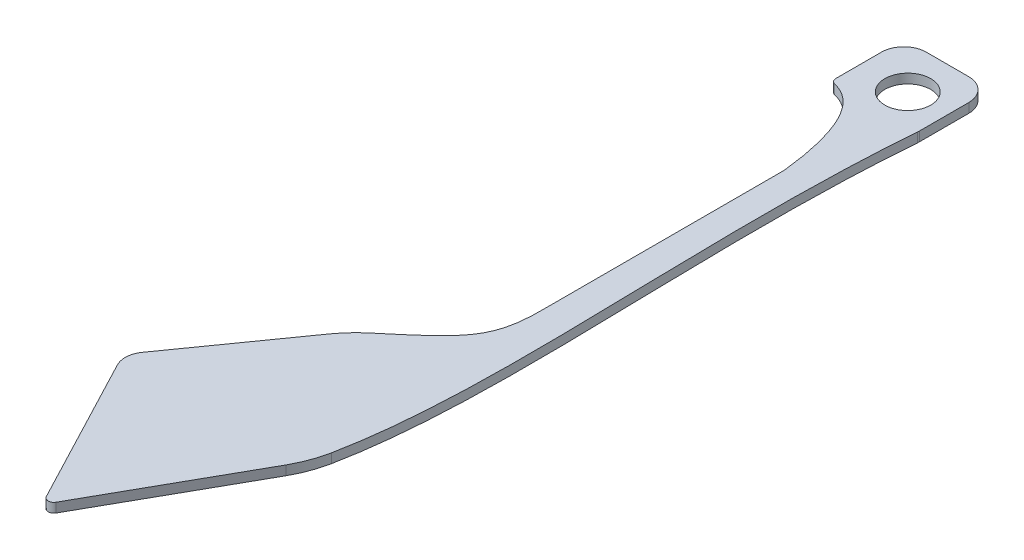
ISO-10303-21;
HEADER;
FILE_DESCRIPTION(('STEP AP214'),'2;1');
FILE_NAME('part.step','',(''),(''),'','','');
FILE_SCHEMA(('AUTOMOTIVE_DESIGN { 1 0 10303 214 1 1 1 1 }'));
ENDSEC;
DATA;
#1=APPLICATION_CONTEXT('core data for automotive mechanical design processes');
#2=APPLICATION_PROTOCOL_DEFINITION('international standard','automotive_design',2000,#1);
#3=PRODUCT_CONTEXT('',#1,'mechanical');
#4=PRODUCT('Part','Part','',(#3));
#5=PRODUCT_RELATED_PRODUCT_CATEGORY('part','',(#4));
#6=PRODUCT_DEFINITION_FORMATION('','',#4);
#7=PRODUCT_DEFINITION_CONTEXT('part definition',#1,'design');
#8=PRODUCT_DEFINITION('design','',#6,#7);
#9=PRODUCT_DEFINITION_SHAPE('','',#8);
#10=(LENGTH_UNIT() NAMED_UNIT(*) SI_UNIT(.MILLI.,.METRE.));
#11=(NAMED_UNIT(*) PLANE_ANGLE_UNIT() SI_UNIT($,.RADIAN.));
#12=(NAMED_UNIT(*) SI_UNIT($,.STERADIAN.) SOLID_ANGLE_UNIT());
#13=UNCERTAINTY_MEASURE_WITH_UNIT(LENGTH_MEASURE(1.E-05),#10,'distance_accuracy_value','');
#14=(GEOMETRIC_REPRESENTATION_CONTEXT(3) GLOBAL_UNCERTAINTY_ASSIGNED_CONTEXT((#13)) GLOBAL_UNIT_ASSIGNED_CONTEXT((#10,
#11,#12)) REPRESENTATION_CONTEXT('',''));
#15=CARTESIAN_POINT('',(0.,0.,0.));
#16=DIRECTION('',(0.,0.,1.));
#17=DIRECTION('',(1.,0.,0.));
#18=AXIS2_PLACEMENT_3D('',#15,#16,#17);
#19=CARTESIAN_POINT('',(2.49999999999999,0.42,-68.));
#20=CARTESIAN_POINT('',(6.3647415815063,0.42,-67.5768511235133));
#21=CARTESIAN_POINT('',(7.29999999999999,0.42,-59.));
#22=B_SPLINE_CURVE_WITH_KNOTS('',2,(#19,#20,#21),.UNSPECIFIED.,.F.,.F.,(3,3),(0.,1.),.UNSPECIFIED.);
#23=DIRECTION('',(0.,-1.,0.));
#24=VECTOR('',#23,1.);
#25=SURFACE_OF_LINEAR_EXTRUSION('',#22,#24);
#26=CARTESIAN_POINT('',(2.49999999999999,-0.42,-68.));
#27=CARTESIAN_POINT('',(6.3647415815063,-0.42,-67.5768511235133));
#28=CARTESIAN_POINT('',(7.29999999999999,-0.42,-59.));
#29=B_SPLINE_CURVE_WITH_KNOTS('',2,(#26,#27,#28),.UNSPECIFIED.,.F.,.F.,(3,3),(0.,1.),.UNSPECIFIED.);
#30=CARTESIAN_POINT('',(2.88944110343177,-0.42,-67.9349845605461));
#31=VERTEX_POINT('',#30);
#32=CARTESIAN_POINT('',(7.28757495151825,-0.42,-59.1124309318197));
#33=VERTEX_POINT('',#32);
#34=EDGE_CURVE('E351',#31,#33,#29,.T.);
#35=ORIENTED_EDGE('',*,*,#34,.T.);
#36=DIRECTION('',(0.,-1.,0.));
#37=VECTOR('',#36,1.);
#38=CARTESIAN_POINT('',(7.28757495151825,-0.42,-59.1124309318197));
#39=LINE('',#38,#37);
#40=CARTESIAN_POINT('',(7.28757495151825,0.42,-59.1124309318197));
#41=VERTEX_POINT('',#40);
#42=EDGE_CURVE('E345',#33,#41,#39,.F.);
#43=ORIENTED_EDGE('',*,*,#42,.T.);
#44=CARTESIAN_POINT('',(2.88944110343177,0.42,-67.9349845605461));
#45=VERTEX_POINT('',#44);
#46=EDGE_CURVE('E228',#45,#41,#22,.T.);
#47=ORIENTED_EDGE('',*,*,#46,.F.);
#48=DIRECTION('',(0.,-1.,0.));
#49=VECTOR('',#48,1.);
#50=CARTESIAN_POINT('',(2.8894411034363,0.42,-67.9349845605451));
#51=LINE('',#50,#49);
#52=EDGE_CURVE('E249',#45,#31,#51,.T.);
#53=ORIENTED_EDGE('',*,*,#52,.T.);
#54=EDGE_LOOP('',(#35,#43,#47,#53));
#55=FACE_BOUND('',#54,.T.);
#56=ADVANCED_FACE('F39',(#55),#25,.F.);
#57=CARTESIAN_POINT('',(7.29999999999999,0.42,-59.));
#58=DIRECTION('',(1.,0.,0.));
#59=DIRECTION('',(0.,0.,-1.));
#60=AXIS2_PLACEMENT_3D('',#57,#58,#59);
#61=PLANE('',#60);
#62=DIRECTION('',(0.,0.,1.));
#63=VECTOR('',#62,1.);
#64=CARTESIAN_POINT('',(7.29999999999999,-0.42,-59.));
#65=LINE('',#64,#63);
#66=CARTESIAN_POINT('',(7.29999999999999,-0.42,-58.8898420459849));
#67=VERTEX_POINT('',#66);
#68=CARTESIAN_POINT('',(7.29999999999999,-0.42,-38.0186347256267));
#69=VERTEX_POINT('',#68);
#70=EDGE_CURVE('E352',#67,#69,#65,.T.);
#71=ORIENTED_EDGE('',*,*,#70,.T.);
#72=DIRECTION('',(0.,-1.,0.));
#73=VECTOR('',#72,1.);
#74=CARTESIAN_POINT('',(7.29999999999999,0.42,-38.0186347256267));
#75=LINE('',#74,#73);
#76=CARTESIAN_POINT('',(7.29999999999999,0.42,-38.0186347256267));
#77=VERTEX_POINT('',#76);
#78=EDGE_CURVE('E63',#69,#77,#75,.F.);
#79=ORIENTED_EDGE('',*,*,#78,.T.);
#80=DIRECTION('',(0.,0.,1.));
#81=VECTOR('',#80,1.);
#82=CARTESIAN_POINT('',(7.29999999999999,0.42,-59.));
#83=LINE('',#82,#81);
#84=CARTESIAN_POINT('',(7.29999999999999,0.42,-58.8898420459849));
#85=VERTEX_POINT('',#84);
#86=EDGE_CURVE('E365',#85,#77,#83,.T.);
#87=ORIENTED_EDGE('',*,*,#86,.F.);
#88=DIRECTION('',(0.,1.,0.));
#89=VECTOR('',#88,1.);
#90=CARTESIAN_POINT('',(7.29999999999999,-0.42,-58.8898420459849));
#91=LINE('',#90,#89);
#92=EDGE_CURVE('E339',#85,#67,#91,.F.);
#93=ORIENTED_EDGE('',*,*,#92,.T.);
#94=EDGE_LOOP('',(#71,#79,#87,#93));
#95=FACE_BOUND('',#94,.T.);
#96=ADVANCED_FACE('F366',(#95),#61,.F.);
#97=CARTESIAN_POINT('',(7.3,0.42,-38.));
#98=CARTESIAN_POINT('',(7.40070922790046,0.42,-32.6745142174048));
#99=CARTESIAN_POINT('',(6.14707667491354,0.42,-31.9100338065075));
#100=CARTESIAN_POINT('',(0.382846680649186,0.42,-27.0812248532739));
#101=B_SPLINE_CURVE_WITH_KNOTS('',3,(#97,#98,#99,#100),.UNSPECIFIED.,.F.,.F.,(4,4),(0.,1.),.UNSPECIFIED.);
#102=DIRECTION('',(0.,-1.,0.));
#103=VECTOR('',#102,1.);
#104=SURFACE_OF_LINEAR_EXTRUSION('',#101,#103);
#105=CARTESIAN_POINT('',(7.30033733419369,0.42,-37.9819029549033));
#106=VERTEX_POINT('',#105);
#107=CARTESIAN_POINT('',(1.38129854213453,0.42,-27.9158322200809));
#108=VERTEX_POINT('',#107);
#109=EDGE_CURVE('E368',#106,#108,#101,.T.);
#110=ORIENTED_EDGE('',*,*,#109,.F.);
#111=DIRECTION('',(0.,-1.,0.));
#112=VECTOR('',#111,1.);
#113=CARTESIAN_POINT('',(7.3003373341937,0.42,-37.9819029549033));
#114=LINE('',#113,#112);
#115=CARTESIAN_POINT('',(7.30033733419369,-0.42,-37.9819029549033));
#116=VERTEX_POINT('',#115);
#117=EDGE_CURVE('E335',#106,#116,#114,.T.);
#118=ORIENTED_EDGE('',*,*,#117,.T.);
#119=CARTESIAN_POINT('',(7.3,-0.42,-38.));
#120=CARTESIAN_POINT('',(7.40070922790046,-0.42,-32.6745142174048));
#121=CARTESIAN_POINT('',(6.14707667491354,-0.42,-31.9100338065075));
#122=CARTESIAN_POINT('',(0.382846680649186,-0.42,-27.0812248532739));
#123=B_SPLINE_CURVE_WITH_KNOTS('',3,(#119,#120,#121,#122),.UNSPECIFIED.,.F.,.F.,(4,4),(0.,1.),.UNSPECIFIED.);
#124=CARTESIAN_POINT('',(1.38129854213453,-0.42,-27.9158322200809));
#125=VERTEX_POINT('',#124);
#126=EDGE_CURVE('E437',#116,#125,#123,.T.);
#127=ORIENTED_EDGE('',*,*,#126,.T.);
#128=DIRECTION('',(0.,-1.,0.));
#129=VECTOR('',#128,1.);
#130=CARTESIAN_POINT('',(1.38129854213463,-0.42,-27.915832220081));
#131=LINE('',#130,#129);
#132=EDGE_CURVE('E245',#125,#108,#131,.F.);
#133=ORIENTED_EDGE('',*,*,#132,.T.);
#134=EDGE_LOOP('',(#110,#118,#127,#133));
#135=FACE_BOUND('',#134,.T.);
#136=ADVANCED_FACE('F388',(#135),#104,.F.);
#137=CARTESIAN_POINT('',(-8.00000000000001,0.42,-15.25));
#138=DIRECTION('',(0.815946541605103,0.,0.578127357286154));
#139=DIRECTION('',(0.578127357286154,0.,-0.815946541605103));
#140=AXIS2_PLACEMENT_3D('',#137,#138,#139);
#141=PLANE('',#140);
#142=DIRECTION('',(-0.578127357286154,0.,0.815946541605103));
#143=VECTOR('',#142,1.);
#144=CARTESIAN_POINT('',(-8.00000000000001,-0.42,-15.25));
#145=LINE('',#144,#143);
#146=CARTESIAN_POINT('',(-0.367431686981779,-0.42,-26.022311048912));
#147=VERTEX_POINT('',#146);
#148=CARTESIAN_POINT('',(-7.29144619961959,-0.42,-16.2500253675513));
#149=VERTEX_POINT('',#148);
#150=EDGE_CURVE('E441',#147,#149,#145,.T.);
#151=ORIENTED_EDGE('',*,*,#150,.T.);
#152=DIRECTION('',(0.,-1.,0.));
#153=VECTOR('',#152,1.);
#154=CARTESIAN_POINT('',(-7.29144619961959,0.42,-16.2500253675513));
#155=LINE('',#154,#153);
#156=CARTESIAN_POINT('',(-7.29144619961959,0.42,-16.2500253675513));
#157=VERTEX_POINT('',#156);
#158=EDGE_CURVE('E299',#149,#157,#155,.F.);
#159=ORIENTED_EDGE('',*,*,#158,.T.);
#160=DIRECTION('',(-0.578127357286154,0.,0.815946541605103));
#161=VECTOR('',#160,1.);
#162=CARTESIAN_POINT('',(-8.00000000000001,0.42,-15.25));
#163=LINE('',#162,#161);
#164=CARTESIAN_POINT('',(-0.367431686981779,0.42,-26.022311048912));
#165=VERTEX_POINT('',#164);
#166=EDGE_CURVE('E372',#165,#157,#163,.T.);
#167=ORIENTED_EDGE('',*,*,#166,.F.);
#168=DIRECTION('',(0.,-1.,0.));
#169=VECTOR('',#168,1.);
#170=CARTESIAN_POINT('',(-0.36743168698178,0.42,-26.022311048912));
#171=LINE('',#170,#169);
#172=EDGE_CURVE('E241',#165,#147,#171,.T.);
#173=ORIENTED_EDGE('',*,*,#172,.T.);
#174=EDGE_LOOP('',(#151,#159,#167,#173));
#175=FACE_BOUND('',#174,.T.);
#176=ADVANCED_FACE('F392',(#175),#141,.F.);
#177=CARTESIAN_POINT('',(-8.00000000000001,0.42,-15.25));
#178=DIRECTION('',(0.8855472253378,0.,-0.464549364111634));
#179=DIRECTION('',(-0.464549364111634,0.,-0.8855472253378));
#180=AXIS2_PLACEMENT_3D('',#177,#178,#179);
#181=PLANE('',#180);
#182=DIRECTION('',(0.464549364111634,0.,0.8855472253378));
#183=VECTOR('',#182,1.);
#184=CARTESIAN_POINT('',(-8.00000000000001,-0.42,-15.25));
#185=LINE('',#184,#183);
#186=CARTESIAN_POINT('',(-7.43064756708499,-0.42,-14.1646719247557));
#187=VERTEX_POINT('',#186);
#188=CARTESIAN_POINT('',(-0.427796746973085,-0.42,-0.815487548917443));
#189=VERTEX_POINT('',#188);
#190=EDGE_CURVE('E214',#187,#189,#185,.T.);
#191=ORIENTED_EDGE('',*,*,#190,.T.);
#192=DIRECTION('',(0.,-1.,0.));
#193=VECTOR('',#192,1.);
#194=CARTESIAN_POINT('',(-0.427796746973084,0.42,-0.815487548917443));
#195=LINE('',#194,#193);
#196=CARTESIAN_POINT('',(-0.427796746973085,0.42,-0.815487548917443));
#197=VERTEX_POINT('',#196);
#198=EDGE_CURVE('E312',#189,#197,#195,.F.);
#199=ORIENTED_EDGE('',*,*,#198,.T.);
#200=DIRECTION('',(0.464549364111634,0.,0.8855472253378));
#201=VECTOR('',#200,1.);
#202=CARTESIAN_POINT('',(-8.00000000000001,0.42,-15.25));
#203=LINE('',#202,#201);
#204=CARTESIAN_POINT('',(-7.43064756708499,0.42,-14.1646719247557));
#205=VERTEX_POINT('',#204);
#206=EDGE_CURVE('E466',#205,#197,#203,.T.);
#207=ORIENTED_EDGE('',*,*,#206,.F.);
#208=DIRECTION('',(0.,-1.,0.));
#209=VECTOR('',#208,1.);
#210=CARTESIAN_POINT('',(-7.43064756708499,0.42,-14.1646719247557));
#211=LINE('',#210,#209);
#212=EDGE_CURVE('E292',#205,#187,#211,.T.);
#213=ORIENTED_EDGE('',*,*,#212,.T.);
#214=EDGE_LOOP('',(#191,#199,#207,#213));
#215=FACE_BOUND('',#214,.T.);
#216=ADVANCED_FACE('F458',(#215),#181,.F.);
#217=CARTESIAN_POINT('',(0.,0.42,0.));
#218=DIRECTION('',(-0.871907465306406,0.,-0.489670677029938));
#219=DIRECTION('',(-0.489670677029938,0.,0.871907465306406));
#220=AXIS2_PLACEMENT_3D('',#217,#218,#219);
#221=PLANE('',#220);
#222=DIRECTION('',(0.489670677029938,0.,-0.871907465306406));
#223=VECTOR('',#222,1.);
#224=CARTESIAN_POINT('',(0.,0.42,0.));
#225=LINE('',#224,#223);
#226=CARTESIAN_POINT('',(0.45093059834902,0.42,-0.80292689245829));
#227=VERTEX_POINT('',#226);
#228=CARTESIAN_POINT('',(7.84433889687078,0.42,-13.967627561568));
#229=VERTEX_POINT('',#228);
#230=EDGE_CURVE('E465',#227,#229,#225,.T.);
#231=ORIENTED_EDGE('',*,*,#230,.F.);
#232=DIRECTION('',(0.,-1.,0.));
#233=VECTOR('',#232,1.);
#234=CARTESIAN_POINT('',(0.45093059834902,0.42,-0.80292689245829));
#235=LINE('',#234,#233);
#236=CARTESIAN_POINT('',(0.45093059834902,-0.42,-0.80292689245829));
#237=VERTEX_POINT('',#236);
#238=EDGE_CURVE('E305',#227,#237,#235,.T.);
#239=ORIENTED_EDGE('',*,*,#238,.T.);
#240=DIRECTION('',(0.489670677029938,0.,-0.871907465306406));
#241=VECTOR('',#240,1.);
#242=CARTESIAN_POINT('',(0.,-0.42,0.));
#243=LINE('',#242,#241);
#244=CARTESIAN_POINT('',(7.84433889687078,-0.42,-13.967627561568));
#245=VERTEX_POINT('',#244);
#246=EDGE_CURVE('E208',#237,#245,#243,.T.);
#247=ORIENTED_EDGE('',*,*,#246,.T.);
#248=DIRECTION('',(0.,-1.,0.));
#249=VECTOR('',#248,1.);
#250=CARTESIAN_POINT('',(7.84433889687078,0.42,-13.967627561568));
#251=LINE('',#250,#249);
#252=EDGE_CURVE('E185',#245,#229,#251,.F.);
#253=ORIENTED_EDGE('',*,*,#252,.T.);
#254=EDGE_LOOP('',(#231,#239,#247,#253));
#255=FACE_BOUND('',#254,.T.);
#256=ADVANCED_FACE('F468',(#255),#221,.F.);
#257=CARTESIAN_POINT('',(8.56453020743702,0.42,-15.25));
#258=CARTESIAN_POINT('',(11.8168917487992,0.42,-28.4825570390397));
#259=CARTESIAN_POINT('',(8.71439861678246,0.42,-49.1108253899896));
#260=CARTESIAN_POINT('',(10.3,0.42,-68.));
#261=B_SPLINE_CURVE_WITH_KNOTS('',3,(#257,#258,#259,#260),.UNSPECIFIED.,.F.,.F.,(4,4),(0.,1.),.UNSPECIFIED.);
#262=DIRECTION('',(0.,-1.,0.));
#263=VECTOR('',#262,1.);
#264=SURFACE_OF_LINEAR_EXTRUSION('',#261,#263);
#265=CARTESIAN_POINT('',(8.56453020743702,-0.42,-15.25));
#266=CARTESIAN_POINT('',(11.8168917487992,-0.42,-28.4825570390397));
#267=CARTESIAN_POINT('',(8.71439861678246,-0.42,-49.1108253899896));
#268=CARTESIAN_POINT('',(10.3,-0.42,-68.));
#269=B_SPLINE_CURVE_WITH_KNOTS('',3,(#265,#266,#267,#268),.UNSPECIFIED.,.F.,.F.,(4,4),(0.,1.),.UNSPECIFIED.);
#270=CARTESIAN_POINT('',(8.9330406365142,-0.42,-16.9130470053443));
#271=VERTEX_POINT('',#270);
#272=CARTESIAN_POINT('',(10.2931135464354,-0.42,-67.9175973041701));
#273=VERTEX_POINT('',#272);
#274=EDGE_CURVE('E196',#271,#273,#269,.T.);
#275=ORIENTED_EDGE('',*,*,#274,.T.);
#276=DIRECTION('',(0.,-1.,0.));
#277=VECTOR('',#276,1.);
#278=CARTESIAN_POINT('',(10.2931135464356,-0.42,-67.9175973041725));
#279=LINE('',#278,#277);
#280=CARTESIAN_POINT('',(10.2931135464354,0.42,-67.9175973041701));
#281=VERTEX_POINT('',#280);
#282=EDGE_CURVE('E327',#273,#281,#279,.F.);
#283=ORIENTED_EDGE('',*,*,#282,.T.);
#284=CARTESIAN_POINT('',(8.9330406365142,0.42,-16.9130470053443));
#285=VERTEX_POINT('',#284);
#286=EDGE_CURVE('E199',#285,#281,#261,.T.);
#287=ORIENTED_EDGE('',*,*,#286,.F.);
#288=DIRECTION('',(0.,-1.,0.));
#289=VECTOR('',#288,1.);
#290=CARTESIAN_POINT('',(8.9330406365142,0.42,-16.9130470053443));
#291=LINE('',#290,#289);
#292=EDGE_CURVE('E183',#285,#271,#291,.T.);
#293=ORIENTED_EDGE('',*,*,#292,.T.);
#294=EDGE_LOOP('',(#275,#283,#287,#293));
#295=FACE_BOUND('',#294,.T.);
#296=ADVANCED_FACE('F195',(#295),#264,.F.);
#297=CARTESIAN_POINT('',(10.3,0.42,-74.5));
#298=DIRECTION('',(-1.,0.,0.));
#299=DIRECTION('',(0.,0.,1.));
#300=AXIS2_PLACEMENT_3D('',#297,#298,#299);
#301=PLANE('',#300);
#302=DIRECTION('',(0.,0.,-1.));
#303=VECTOR('',#302,1.);
#304=CARTESIAN_POINT('',(10.3,0.42,-74.5));
#305=LINE('',#304,#303);
#306=CARTESIAN_POINT('',(10.3,0.42,-68.0834236923464));
#307=VERTEX_POINT('',#306);
#308=CARTESIAN_POINT('',(10.3,0.42,-72.5));
#309=VERTEX_POINT('',#308);
#310=EDGE_CURVE('E473',#307,#309,#305,.T.);
#311=ORIENTED_EDGE('',*,*,#310,.F.);
#312=DIRECTION('',(0.,-1.,0.));
#313=VECTOR('',#312,1.);
#314=CARTESIAN_POINT('',(10.3,0.42,-68.0834236923464));
#315=LINE('',#314,#313);
#316=CARTESIAN_POINT('',(10.3,-0.42,-68.0834236923464));
#317=VERTEX_POINT('',#316);
#318=EDGE_CURVE('E318',#307,#317,#315,.T.);
#319=ORIENTED_EDGE('',*,*,#318,.T.);
#320=DIRECTION('',(0.,0.,-1.));
#321=VECTOR('',#320,1.);
#322=CARTESIAN_POINT('',(10.3,-0.42,-74.5));
#323=LINE('',#322,#321);
#324=CARTESIAN_POINT('',(10.3,-0.42,-72.5));
#325=VERTEX_POINT('',#324);
#326=EDGE_CURVE('E207',#317,#325,#323,.T.);
#327=ORIENTED_EDGE('',*,*,#326,.T.);
#328=DIRECTION('',(0.,-1.,0.));
#329=VECTOR('',#328,1.);
#330=CARTESIAN_POINT('',(10.3,0.42,-72.5));
#331=LINE('',#330,#329);
#332=EDGE_CURVE('E288',#325,#309,#331,.F.);
#333=ORIENTED_EDGE('',*,*,#332,.T.);
#334=EDGE_LOOP('',(#311,#319,#327,#333));
#335=FACE_BOUND('',#334,.T.);
#336=ADVANCED_FACE('F487',(#335),#301,.F.);
#337=CARTESIAN_POINT('',(2.49999999999999,0.42,-74.5));
#338=DIRECTION('',(0.,0.,1.));
#339=DIRECTION('',(1.,0.,0.));
#340=AXIS2_PLACEMENT_3D('',#337,#338,#339);
#341=PLANE('',#340);
#342=DIRECTION('',(-1.,0.,0.));
#343=VECTOR('',#342,1.);
#344=CARTESIAN_POINT('',(2.49999999999999,-0.42,-74.5));
#345=LINE('',#344,#343);
#346=CARTESIAN_POINT('',(8.29999999999998,-0.42,-74.5));
#347=VERTEX_POINT('',#346);
#348=CARTESIAN_POINT('',(4.49999999999999,-0.42,-74.5));
#349=VERTEX_POINT('',#348);
#350=EDGE_CURVE('E212',#347,#349,#345,.T.);
#351=ORIENTED_EDGE('',*,*,#350,.T.);
#352=DIRECTION('',(0.,-1.,0.));
#353=VECTOR('',#352,1.);
#354=CARTESIAN_POINT('',(4.49999999999999,0.42,-74.5));
#355=LINE('',#354,#353);
#356=CARTESIAN_POINT('',(4.49999999999999,0.42,-74.5));
#357=VERTEX_POINT('',#356);
#358=EDGE_CURVE('E279',#349,#357,#355,.F.);
#359=ORIENTED_EDGE('',*,*,#358,.T.);
#360=DIRECTION('',(-1.,0.,0.));
#361=VECTOR('',#360,1.);
#362=CARTESIAN_POINT('',(2.49999999999999,0.42,-74.5));
#363=LINE('',#362,#361);
#364=CARTESIAN_POINT('',(8.29999999999998,0.42,-74.5));
#365=VERTEX_POINT('',#364);
#366=EDGE_CURVE('E639',#365,#357,#363,.T.);
#367=ORIENTED_EDGE('',*,*,#366,.F.);
#368=DIRECTION('',(0.,-1.,0.));
#369=VECTOR('',#368,1.);
#370=CARTESIAN_POINT('',(8.29999999999998,0.42,-74.5));
#371=LINE('',#370,#369);
#372=EDGE_CURVE('E275',#365,#347,#371,.T.);
#373=ORIENTED_EDGE('',*,*,#372,.T.);
#374=EDGE_LOOP('',(#351,#359,#367,#373));
#375=FACE_BOUND('',#374,.T.);
#376=ADVANCED_FACE('F594',(#375),#341,.F.);
#377=CARTESIAN_POINT('',(2.49999999999999,0.42,-68.));
#378=DIRECTION('',(1.,0.,0.));
#379=DIRECTION('',(0.,0.,-1.));
#380=AXIS2_PLACEMENT_3D('',#377,#378,#379);
#381=PLANE('',#380);
#382=DIRECTION('',(0.,0.,1.));
#383=VECTOR('',#382,1.);
#384=CARTESIAN_POINT('',(2.49999999999999,0.42,-68.));
#385=LINE('',#384,#383);
#386=CARTESIAN_POINT('',(2.49999999999999,0.42,-72.5));
#387=VERTEX_POINT('',#386);
#388=CARTESIAN_POINT('',(2.49999999999999,0.42,-68.4226081145195));
#389=VERTEX_POINT('',#388);
#390=EDGE_CURVE('E201',#387,#389,#385,.T.);
#391=ORIENTED_EDGE('',*,*,#390,.F.);
#392=DIRECTION('',(0.,-1.,0.));
#393=VECTOR('',#392,1.);
#394=CARTESIAN_POINT('',(2.49999999999999,0.42,-72.5));
#395=LINE('',#394,#393);
#396=CARTESIAN_POINT('',(2.49999999999999,-0.42,-72.5));
#397=VERTEX_POINT('',#396);
#398=EDGE_CURVE('E264',#387,#397,#395,.T.);
#399=ORIENTED_EDGE('',*,*,#398,.T.);
#400=DIRECTION('',(0.,0.,1.));
#401=VECTOR('',#400,1.);
#402=CARTESIAN_POINT('',(2.49999999999999,-0.42,-68.));
#403=LINE('',#402,#401);
#404=CARTESIAN_POINT('',(2.49999999999999,-0.42,-68.4226081145195));
#405=VERTEX_POINT('',#404);
#406=EDGE_CURVE('E226',#397,#405,#403,.T.);
#407=ORIENTED_EDGE('',*,*,#406,.T.);
#408=DIRECTION('',(0.,-1.,0.));
#409=VECTOR('',#408,1.);
#410=CARTESIAN_POINT('',(2.49999999999999,0.42,-68.4226081145195));
#411=LINE('',#410,#409);
#412=EDGE_CURVE('E257',#405,#389,#411,.F.);
#413=ORIENTED_EDGE('',*,*,#412,.T.);
#414=EDGE_LOOP('',(#391,#399,#407,#413));
#415=FACE_BOUND('',#414,.T.);
#416=ADVANCED_FACE('F586',(#415),#381,.F.);
#417=CARTESIAN_POINT('',(5.63237079075314,0.42,-65.5384255617566));
#418=DIRECTION('',(0.,1.,0.));
#419=DIRECTION('',(0.,0.,1.));
#420=AXIS2_PLACEMENT_3D('',#417,#418,#419);
#421=PLANE('',#420);
#422=CARTESIAN_POINT('',(6.74999999999998,0.42,-70.6));
#423=DIRECTION('',(0.,1.,0.));
#424=DIRECTION('',(0.,0.,1.));
#425=AXIS2_PLACEMENT_3D('',#422,#423,#424);
#426=CIRCLE('',#425,2.05);
#427=CARTESIAN_POINT('',(6.74999999999998,0.42,-68.55));
#428=VERTEX_POINT('',#427);
#429=EDGE_CURVE('E662',#428,#428,#426,.T.);
#430=ORIENTED_EDGE('',*,*,#429,.F.);
#431=EDGE_LOOP('',(#430));
#432=FACE_BOUND('',#431,.T.);
#433=ORIENTED_EDGE('',*,*,#286,.T.);
#434=CARTESIAN_POINT('',(8.29999999999999,0.42,-68.0834236923464));
#435=DIRECTION('',(0.,1.,0.));
#436=DIRECTION('',(0.,0.,1.));
#437=AXIS2_PLACEMENT_3D('',#434,#435,#436);
#438=CIRCLE('',#437,2.);
#439=EDGE_CURVE('E332',#281,#307,#438,.T.);
#440=ORIENTED_EDGE('',*,*,#439,.T.);
#441=ORIENTED_EDGE('',*,*,#310,.T.);
#442=CARTESIAN_POINT('',(8.29999999999998,0.42,-72.5));
#443=DIRECTION('',(0.,1.,0.));
#444=DIRECTION('',(0.,0.,1.));
#445=AXIS2_PLACEMENT_3D('',#442,#443,#444);
#446=CIRCLE('',#445,2.);
#447=EDGE_CURVE('E282',#309,#365,#446,.T.);
#448=ORIENTED_EDGE('',*,*,#447,.T.);
#449=ORIENTED_EDGE('',*,*,#366,.T.);
#450=CARTESIAN_POINT('',(4.49999999999999,0.42,-72.5));
#451=DIRECTION('',(0.,1.,0.));
#452=DIRECTION('',(0.,0.,1.));
#453=AXIS2_PLACEMENT_3D('',#450,#451,#452);
#454=CIRCLE('',#453,2.);
#455=EDGE_CURVE('E285',#357,#387,#454,.T.);
#456=ORIENTED_EDGE('',*,*,#455,.T.);
#457=ORIENTED_EDGE('',*,*,#390,.T.);
#458=CARTESIAN_POINT('',(2.99999999999999,0.42,-68.4226081145195));
#459=DIRECTION('',(0.,1.,0.));
#460=DIRECTION('',(0.,0.,1.));
#461=AXIS2_PLACEMENT_3D('',#458,#459,#460);
#462=CIRCLE('',#461,0.5);
#463=EDGE_CURVE('E261',#389,#45,#462,.T.);
#464=ORIENTED_EDGE('',*,*,#463,.T.);
#465=ORIENTED_EDGE('',*,*,#46,.T.);
#466=CARTESIAN_POINT('',(5.29999999999998,0.42,-58.8898420459849));
#467=DIRECTION('',(0.,1.,0.));
#468=DIRECTION('',(0.,0.,1.));
#469=AXIS2_PLACEMENT_3D('',#466,#467,#468);
#470=CIRCLE('',#469,2.);
#471=EDGE_CURVE('E11',#41,#85,#470,.F.);
#472=ORIENTED_EDGE('',*,*,#471,.T.);
#473=ORIENTED_EDGE('',*,*,#86,.T.);
#474=CARTESIAN_POINT('',(9.29999999999999,0.42,-38.0186347256267));
#475=DIRECTION('',(0.,1.,0.));
#476=DIRECTION('',(0.,0.,1.));
#477=AXIS2_PLACEMENT_3D('',#474,#475,#476);
#478=CIRCLE('',#477,2.);
#479=EDGE_CURVE('E55',#77,#106,#478,.T.);
#480=ORIENTED_EDGE('',*,*,#479,.T.);
#481=ORIENTED_EDGE('',*,*,#109,.T.);
#482=CARTESIAN_POINT('',(7.79203372906925,0.42,-20.2410374760504));
#483=DIRECTION('',(0.,1.,0.));
#484=DIRECTION('',(0.,0.,1.));
#485=AXIS2_PLACEMENT_3D('',#482,#483,#484);
#486=CIRCLE('',#485,10.);
#487=EDGE_CURVE('E235',#108,#165,#486,.T.);
#488=ORIENTED_EDGE('',*,*,#487,.T.);
#489=ORIENTED_EDGE('',*,*,#166,.T.);
#490=CARTESIAN_POINT('',(-5.65955311640939,0.42,-15.093770652979));
#491=DIRECTION('',(0.,1.,0.));
#492=DIRECTION('',(0.,0.,1.));
#493=AXIS2_PLACEMENT_3D('',#490,#491,#492);
#494=CIRCLE('',#493,2.);
#495=EDGE_CURVE('E302',#157,#205,#494,.T.);
#496=ORIENTED_EDGE('',*,*,#495,.T.);
#497=ORIENTED_EDGE('',*,*,#206,.T.);
#498=CARTESIAN_POINT('',(0.0149768656958171,0.42,-1.04776223097326));
#499=DIRECTION('',(0.,1.,0.));
#500=DIRECTION('',(0.,0.,1.));
#501=AXIS2_PLACEMENT_3D('',#498,#499,#500);
#502=CIRCLE('',#501,0.5);
#503=EDGE_CURVE('E315',#197,#227,#502,.T.);
#504=ORIENTED_EDGE('',*,*,#503,.T.);
#505=ORIENTED_EDGE('',*,*,#230,.T.);
#506=CARTESIAN_POINT('',(-0.874735756193287,0.42,-18.8643343318674));
#507=DIRECTION('',(0.,1.,0.));
#508=DIRECTION('',(0.,0.,1.));
#509=AXIS2_PLACEMENT_3D('',#506,#507,#508);
#510=CIRCLE('',#509,10.);
#511=EDGE_CURVE('E238',#229,#285,#510,.T.);
#512=ORIENTED_EDGE('',*,*,#511,.T.);
#513=EDGE_LOOP('',(#433,#440,#441,#448,#449,#456,#457,#464,#465,#472,#473,#480,#481,#488,#489,
#496,#497,#504,#505,#512));
#514=FACE_BOUND('',#513,.T.);
#515=ADVANCED_FACE('F364',(#432,#514),#421,.T.);
#516=CARTESIAN_POINT('',(5.63237079075314,-0.42,-65.5384255617566));
#517=DIRECTION('',(0.,1.,0.));
#518=DIRECTION('',(0.,0.,1.));
#519=AXIS2_PLACEMENT_3D('',#516,#517,#518);
#520=PLANE('',#519);
#521=CARTESIAN_POINT('',(6.74999999999998,-0.42,-70.6));
#522=DIRECTION('',(0.,1.,0.));
#523=DIRECTION('',(0.,0.,1.));
#524=AXIS2_PLACEMENT_3D('',#521,#522,#523);
#525=CIRCLE('',#524,2.05);
#526=CARTESIAN_POINT('',(6.74999999999998,-0.42,-68.55));
#527=VERTEX_POINT('',#526);
#528=EDGE_CURVE('E361',#527,#527,#525,.T.);
#529=ORIENTED_EDGE('',*,*,#528,.T.);
#530=EDGE_LOOP('',(#529));
#531=FACE_BOUND('',#530,.T.);
#532=ORIENTED_EDGE('',*,*,#326,.F.);
#533=CARTESIAN_POINT('',(8.29999999999999,-0.42,-68.0834236923464));
#534=DIRECTION('',(0.,1.,0.));
#535=DIRECTION('',(0.,0.,1.));
#536=AXIS2_PLACEMENT_3D('',#533,#534,#535);
#537=CIRCLE('',#536,2.);
#538=EDGE_CURVE('E205',#317,#273,#537,.F.);
#539=ORIENTED_EDGE('',*,*,#538,.T.);
#540=ORIENTED_EDGE('',*,*,#274,.F.);
#541=CARTESIAN_POINT('',(-0.874735756193287,-0.42,-18.8643343318674));
#542=DIRECTION('',(0.,1.,0.));
#543=DIRECTION('',(0.,0.,1.));
#544=AXIS2_PLACEMENT_3D('',#541,#542,#543);
#545=CIRCLE('',#544,10.);
#546=EDGE_CURVE('E179',#271,#245,#545,.F.);
#547=ORIENTED_EDGE('',*,*,#546,.T.);
#548=ORIENTED_EDGE('',*,*,#246,.F.);
#549=CARTESIAN_POINT('',(0.0149768656958171,-0.42,-1.04776223097326));
#550=DIRECTION('',(0.,1.,0.));
#551=DIRECTION('',(0.,0.,1.));
#552=AXIS2_PLACEMENT_3D('',#549,#550,#551);
#553=CIRCLE('',#552,0.5);
#554=EDGE_CURVE('E309',#237,#189,#553,.F.);
#555=ORIENTED_EDGE('',*,*,#554,.T.);
#556=ORIENTED_EDGE('',*,*,#190,.F.);
#557=CARTESIAN_POINT('',(-5.65955311640939,-0.42,-15.093770652979));
#558=DIRECTION('',(0.,1.,0.));
#559=DIRECTION('',(0.,0.,1.));
#560=AXIS2_PLACEMENT_3D('',#557,#558,#559);
#561=CIRCLE('',#560,2.);
#562=EDGE_CURVE('E296',#187,#149,#561,.F.);
#563=ORIENTED_EDGE('',*,*,#562,.T.);
#564=ORIENTED_EDGE('',*,*,#150,.F.);
#565=CARTESIAN_POINT('',(7.79203372906925,-0.42,-20.2410374760504));
#566=DIRECTION('',(0.,1.,0.));
#567=DIRECTION('',(0.,0.,1.));
#568=AXIS2_PLACEMENT_3D('',#565,#566,#567);
#569=CIRCLE('',#568,10.);
#570=EDGE_CURVE('E190',#147,#125,#569,.F.);
#571=ORIENTED_EDGE('',*,*,#570,.T.);
#572=ORIENTED_EDGE('',*,*,#126,.F.);
#573=CARTESIAN_POINT('',(9.29999999999999,-0.42,-38.0186347256267));
#574=DIRECTION('',(0.,1.,0.));
#575=DIRECTION('',(0.,0.,1.));
#576=AXIS2_PLACEMENT_3D('',#573,#574,#575);
#577=CIRCLE('',#576,2.);
#578=EDGE_CURVE('E322',#116,#69,#577,.F.);
#579=ORIENTED_EDGE('',*,*,#578,.T.);
#580=ORIENTED_EDGE('',*,*,#70,.F.);
#581=CARTESIAN_POINT('',(5.29999999999998,-0.42,-58.8898420459849));
#582=DIRECTION('',(0.,1.,0.));
#583=DIRECTION('',(0.,0.,1.));
#584=AXIS2_PLACEMENT_3D('',#581,#582,#583);
#585=CIRCLE('',#584,2.);
#586=EDGE_CURVE('E48',#67,#33,#585,.T.);
#587=ORIENTED_EDGE('',*,*,#586,.T.);
#588=ORIENTED_EDGE('',*,*,#34,.F.);
#589=CARTESIAN_POINT('',(2.99999999999999,-0.42,-68.4226081145195));
#590=DIRECTION('',(0.,1.,0.));
#591=DIRECTION('',(0.,0.,1.));
#592=AXIS2_PLACEMENT_3D('',#589,#590,#591);
#593=CIRCLE('',#592,0.5);
#594=EDGE_CURVE('E253',#31,#405,#593,.F.);
#595=ORIENTED_EDGE('',*,*,#594,.T.);
#596=ORIENTED_EDGE('',*,*,#406,.F.);
#597=CARTESIAN_POINT('',(4.49999999999999,-0.42,-72.5));
#598=DIRECTION('',(0.,1.,0.));
#599=DIRECTION('',(0.,0.,1.));
#600=AXIS2_PLACEMENT_3D('',#597,#598,#599);
#601=CIRCLE('',#600,2.);
#602=EDGE_CURVE('E272',#397,#349,#601,.F.);
#603=ORIENTED_EDGE('',*,*,#602,.T.);
#604=ORIENTED_EDGE('',*,*,#350,.F.);
#605=CARTESIAN_POINT('',(8.29999999999998,-0.42,-72.5));
#606=DIRECTION('',(0.,1.,0.));
#607=DIRECTION('',(0.,0.,1.));
#608=AXIS2_PLACEMENT_3D('',#605,#606,#607);
#609=CIRCLE('',#608,2.);
#610=EDGE_CURVE('E268',#347,#325,#609,.F.);
#611=ORIENTED_EDGE('',*,*,#610,.T.);
#612=EDGE_LOOP('',(#532,#539,#540,#547,#548,#555,#556,#563,#564,#571,#572,#579,#580,#587,#588,
#595,#596,#603,#604,#611));
#613=FACE_BOUND('',#612,.T.);
#614=ADVANCED_FACE('F204',(#531,#613),#520,.F.);
#615=CARTESIAN_POINT('',(6.74999999999998,-0.42,-70.6));
#616=DIRECTION('',(0.,1.,0.));
#617=DIRECTION('',(0.,0.,1.));
#618=AXIS2_PLACEMENT_3D('',#615,#616,#617);
#619=CYLINDRICAL_SURFACE('',#618,2.05);
#620=ORIENTED_EDGE('',*,*,#528,.F.);
#621=EDGE_LOOP('',(#620));
#622=FACE_BOUND('',#621,.T.);
#623=ORIENTED_EDGE('',*,*,#429,.T.);
#624=EDGE_LOOP('',(#623));
#625=FACE_BOUND('',#624,.T.);
#626=ADVANCED_FACE('F402',(#622,#625),#619,.F.);
#627=CARTESIAN_POINT('',(-0.874735756193287,0.,-18.8643343318674));
#628=DIRECTION('',(0.,-1.,0.));
#629=DIRECTION('',(0.,0.,-1.));
#630=AXIS2_PLACEMENT_3D('',#627,#628,#629);
#631=CYLINDRICAL_SURFACE('',#630,10.);
#632=ORIENTED_EDGE('',*,*,#511,.F.);
#633=ORIENTED_EDGE('',*,*,#252,.F.);
#634=ORIENTED_EDGE('',*,*,#546,.F.);
#635=ORIENTED_EDGE('',*,*,#292,.F.);
#636=EDGE_LOOP('',(#632,#633,#634,#635));
#637=FACE_BOUND('',#636,.T.);
#638=ADVANCED_FACE('F182',(#637),#631,.T.);
#639=CARTESIAN_POINT('',(7.79203372906925,0.,-20.2410374760504));
#640=DIRECTION('',(0.,-1.,0.));
#641=DIRECTION('',(0.,0.,-1.));
#642=AXIS2_PLACEMENT_3D('',#639,#640,#641);
#643=CYLINDRICAL_SURFACE('',#642,10.);
#644=ORIENTED_EDGE('',*,*,#487,.F.);
#645=ORIENTED_EDGE('',*,*,#132,.F.);
#646=ORIENTED_EDGE('',*,*,#570,.F.);
#647=ORIENTED_EDGE('',*,*,#172,.F.);
#648=EDGE_LOOP('',(#644,#645,#646,#647));
#649=FACE_BOUND('',#648,.T.);
#650=ADVANCED_FACE('F401',(#649),#643,.T.);
#651=CARTESIAN_POINT('',(2.99999999999999,0.,-68.4226081145195));
#652=DIRECTION('',(0.,-1.,0.));
#653=DIRECTION('',(0.,0.,-1.));
#654=AXIS2_PLACEMENT_3D('',#651,#652,#653);
#655=CYLINDRICAL_SURFACE('',#654,0.5);
#656=ORIENTED_EDGE('',*,*,#463,.F.);
#657=ORIENTED_EDGE('',*,*,#412,.F.);
#658=ORIENTED_EDGE('',*,*,#594,.F.);
#659=ORIENTED_EDGE('',*,*,#52,.F.);
#660=EDGE_LOOP('',(#656,#657,#658,#659));
#661=FACE_BOUND('',#660,.T.);
#662=ADVANCED_FACE('F405',(#661),#655,.T.);
#663=CARTESIAN_POINT('',(4.49999999999999,0.42,-72.5));
#664=DIRECTION('',(0.,-1.,0.));
#665=DIRECTION('',(0.,0.,-1.));
#666=AXIS2_PLACEMENT_3D('',#663,#664,#665);
#667=CYLINDRICAL_SURFACE('',#666,2.);
#668=ORIENTED_EDGE('',*,*,#455,.F.);
#669=ORIENTED_EDGE('',*,*,#358,.F.);
#670=ORIENTED_EDGE('',*,*,#602,.F.);
#671=ORIENTED_EDGE('',*,*,#398,.F.);
#672=EDGE_LOOP('',(#668,#669,#670,#671));
#673=FACE_BOUND('',#672,.T.);
#674=ADVANCED_FACE('F409',(#673),#667,.T.);
#675=CARTESIAN_POINT('',(8.29999999999998,0.42,-72.5));
#676=DIRECTION('',(0.,-1.,0.));
#677=DIRECTION('',(0.,0.,-1.));
#678=AXIS2_PLACEMENT_3D('',#675,#676,#677);
#679=CYLINDRICAL_SURFACE('',#678,2.);
#680=ORIENTED_EDGE('',*,*,#447,.F.);
#681=ORIENTED_EDGE('',*,*,#332,.F.);
#682=ORIENTED_EDGE('',*,*,#610,.F.);
#683=ORIENTED_EDGE('',*,*,#372,.F.);
#684=EDGE_LOOP('',(#680,#681,#682,#683));
#685=FACE_BOUND('',#684,.T.);
#686=ADVANCED_FACE('F413',(#685),#679,.T.);
#687=CARTESIAN_POINT('',(-5.65955311640939,0.42,-15.093770652979));
#688=DIRECTION('',(0.,-1.,0.));
#689=DIRECTION('',(0.,0.,-1.));
#690=AXIS2_PLACEMENT_3D('',#687,#688,#689);
#691=CYLINDRICAL_SURFACE('',#690,2.);
#692=ORIENTED_EDGE('',*,*,#495,.F.);
#693=ORIENTED_EDGE('',*,*,#158,.F.);
#694=ORIENTED_EDGE('',*,*,#562,.F.);
#695=ORIENTED_EDGE('',*,*,#212,.F.);
#696=EDGE_LOOP('',(#692,#693,#694,#695));
#697=FACE_BOUND('',#696,.T.);
#698=ADVANCED_FACE('F417',(#697),#691,.T.);
#699=CARTESIAN_POINT('',(0.0149768656958171,0.42,-1.04776223097326));
#700=DIRECTION('',(0.,-1.,0.));
#701=DIRECTION('',(0.,0.,-1.));
#702=AXIS2_PLACEMENT_3D('',#699,#700,#701);
#703=CYLINDRICAL_SURFACE('',#702,0.5);
#704=ORIENTED_EDGE('',*,*,#503,.F.);
#705=ORIENTED_EDGE('',*,*,#198,.F.);
#706=ORIENTED_EDGE('',*,*,#554,.F.);
#707=ORIENTED_EDGE('',*,*,#238,.F.);
#708=EDGE_LOOP('',(#704,#705,#706,#707));
#709=FACE_BOUND('',#708,.T.);
#710=ADVANCED_FACE('F421',(#709),#703,.T.);
#711=CARTESIAN_POINT('',(8.29999999999999,0.,-68.0834236923464));
#712=DIRECTION('',(0.,-1.,0.));
#713=DIRECTION('',(0.,0.,-1.));
#714=AXIS2_PLACEMENT_3D('',#711,#712,#713);
#715=CYLINDRICAL_SURFACE('',#714,2.);
#716=ORIENTED_EDGE('',*,*,#439,.F.);
#717=ORIENTED_EDGE('',*,*,#282,.F.);
#718=ORIENTED_EDGE('',*,*,#538,.F.);
#719=ORIENTED_EDGE('',*,*,#318,.F.);
#720=EDGE_LOOP('',(#716,#717,#718,#719));
#721=FACE_BOUND('',#720,.T.);
#722=ADVANCED_FACE('F425',(#721),#715,.T.);
#723=CARTESIAN_POINT('',(9.29999999999999,0.,-38.0186347256267));
#724=DIRECTION('',(0.,-1.,0.));
#725=DIRECTION('',(0.,0.,-1.));
#726=AXIS2_PLACEMENT_3D('',#723,#724,#725);
#727=CYLINDRICAL_SURFACE('',#726,2.);
#728=ORIENTED_EDGE('',*,*,#479,.F.);
#729=ORIENTED_EDGE('',*,*,#78,.F.);
#730=ORIENTED_EDGE('',*,*,#578,.F.);
#731=ORIENTED_EDGE('',*,*,#117,.F.);
#732=EDGE_LOOP('',(#728,#729,#730,#731));
#733=FACE_BOUND('',#732,.T.);
#734=ADVANCED_FACE('F428',(#733),#727,.T.);
#735=CARTESIAN_POINT('',(5.29999999999998,0.,-58.8898420459849));
#736=DIRECTION('',(0.,-1.,0.));
#737=DIRECTION('',(0.,0.,-1.));
#738=AXIS2_PLACEMENT_3D('',#735,#736,#737);
#739=CYLINDRICAL_SURFACE('',#738,2.);
#740=ORIENTED_EDGE('',*,*,#471,.F.);
#741=ORIENTED_EDGE('',*,*,#42,.F.);
#742=ORIENTED_EDGE('',*,*,#586,.F.);
#743=ORIENTED_EDGE('',*,*,#92,.F.);
#744=EDGE_LOOP('',(#740,#741,#742,#743));
#745=FACE_BOUND('',#744,.T.);
#746=ADVANCED_FACE('F41',(#745),#739,.F.);
#747=CLOSED_SHELL('',(#56,#96,#136,#176,#216,#256,#296,#336,#376,#416,#515,#614,#626,#638,#650,
#662,#674,#686,#698,#710,#722,#734,#746));
#748=MANIFOLD_SOLID_BREP('B2',#747);
#749=ADVANCED_BREP_SHAPE_REPRESENTATION('',(#18,#748),#14);
#750=SHAPE_DEFINITION_REPRESENTATION(#9,#749);
ENDSEC;
END-ISO-10303-21;
